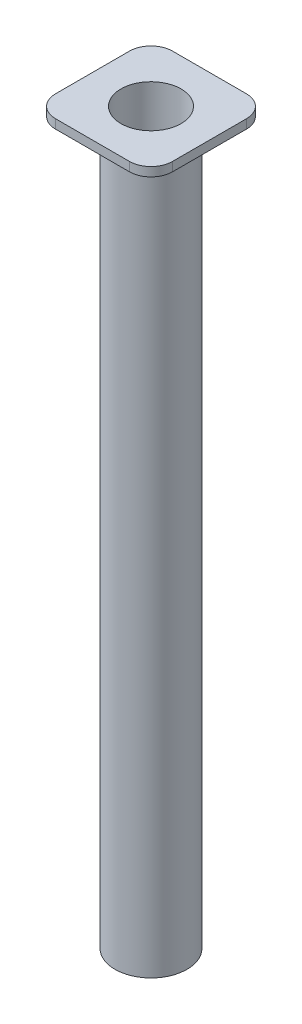
ISO-10303-21;
HEADER;
FILE_DESCRIPTION(('STEP AP214'),'2;1');
FILE_NAME('part.step','',(''),(''),'','','');
FILE_SCHEMA(('AUTOMOTIVE_DESIGN { 1 0 10303 214 1 1 1 1 }'));
ENDSEC;
DATA;
#1=APPLICATION_CONTEXT('core data for automotive mechanical design processes');
#2=APPLICATION_PROTOCOL_DEFINITION('international standard','automotive_design',2000,#1);
#3=PRODUCT_CONTEXT('',#1,'mechanical');
#4=PRODUCT('Part','Part','',(#3));
#5=PRODUCT_RELATED_PRODUCT_CATEGORY('part','',(#4));
#6=PRODUCT_DEFINITION_FORMATION('','',#4);
#7=PRODUCT_DEFINITION_CONTEXT('part definition',#1,'design');
#8=PRODUCT_DEFINITION('design','',#6,#7);
#9=PRODUCT_DEFINITION_SHAPE('','',#8);
#10=(LENGTH_UNIT() NAMED_UNIT(*) SI_UNIT(.MILLI.,.METRE.));
#11=(NAMED_UNIT(*) PLANE_ANGLE_UNIT() SI_UNIT($,.RADIAN.));
#12=(NAMED_UNIT(*) SI_UNIT($,.STERADIAN.) SOLID_ANGLE_UNIT());
#13=UNCERTAINTY_MEASURE_WITH_UNIT(LENGTH_MEASURE(1.E-05),#10,'distance_accuracy_value','');
#14=(GEOMETRIC_REPRESENTATION_CONTEXT(3) GLOBAL_UNCERTAINTY_ASSIGNED_CONTEXT((#13)) GLOBAL_UNIT_ASSIGNED_CONTEXT((#10,
#11,#12)) REPRESENTATION_CONTEXT('',''));
#15=CARTESIAN_POINT('',(0.,0.,0.));
#16=DIRECTION('',(0.,0.,1.));
#17=DIRECTION('',(1.,0.,0.));
#18=AXIS2_PLACEMENT_3D('',#15,#16,#17);
#19=CARTESIAN_POINT('',(0.,0.,0.));
#20=DIRECTION('',(0.,1.,0.));
#21=DIRECTION('',(-1.,0.,0.));
#22=AXIS2_PLACEMENT_3D('',#19,#20,#21);
#23=PLANE('',#22);
#24=CARTESIAN_POINT('',(0.,0.,0.));
#25=DIRECTION('',(0.,-1.,0.));
#26=DIRECTION('',(1.,0.,0.));
#27=AXIS2_PLACEMENT_3D('',#24,#25,#26);
#28=CIRCLE('',#27,16.7);
#29=CARTESIAN_POINT('',(16.7,0.,0.));
#30=VERTEX_POINT('',#29);
#31=EDGE_CURVE('E189',#30,#30,#28,.T.);
#32=ORIENTED_EDGE('',*,*,#31,.F.);
#33=EDGE_LOOP('',(#32));
#34=FACE_BOUND('',#33,.T.);
#35=CARTESIAN_POINT('',(0.,0.,0.));
#36=DIRECTION('',(0.,1.,0.));
#37=DIRECTION('',(-1.,0.,0.));
#38=AXIS2_PLACEMENT_3D('',#35,#36,#37);
#39=CIRCLE('',#38,20.);
#40=CARTESIAN_POINT('',(-20.,0.,0.));
#41=VERTEX_POINT('',#40);
#42=EDGE_CURVE('E11',#41,#41,#39,.T.);
#43=ORIENTED_EDGE('',*,*,#42,.F.);
#44=EDGE_LOOP('',(#43));
#45=FACE_BOUND('',#44,.T.);
#46=ADVANCED_FACE('F32',(#34,#45),#23,.F.);
#47=CARTESIAN_POINT('',(0.,405.,0.));
#48=DIRECTION('',(0.,1.,0.));
#49=DIRECTION('',(-1.,0.,0.));
#50=AXIS2_PLACEMENT_3D('',#47,#48,#49);
#51=CYLINDRICAL_SURFACE('',#50,20.);
#52=CARTESIAN_POINT('',(0.,400.,0.));
#53=DIRECTION('',(0.,-1.,0.));
#54=DIRECTION('',(1.,0.,0.));
#55=AXIS2_PLACEMENT_3D('',#52,#53,#54);
#56=CIRCLE('',#55,20.);
#57=CARTESIAN_POINT('',(20.,400.,0.));
#58=VERTEX_POINT('',#57);
#59=EDGE_CURVE('E35',#58,#58,#56,.T.);
#60=ORIENTED_EDGE('',*,*,#59,.T.);
#61=EDGE_LOOP('',(#60));
#62=FACE_BOUND('',#61,.T.);
#63=ORIENTED_EDGE('',*,*,#42,.T.);
#64=EDGE_LOOP('',(#63));
#65=FACE_BOUND('',#64,.T.);
#66=ADVANCED_FACE('F180',(#62,#65),#51,.T.);
#67=CARTESIAN_POINT('',(-20.5,400.,20.5));
#68=DIRECTION('',(0.,-1.,0.));
#69=DIRECTION('',(1.,0.,0.));
#70=AXIS2_PLACEMENT_3D('',#67,#68,#69);
#71=PLANE('',#70);
#72=CARTESIAN_POINT('',(-20.5,400.,20.5));
#73=DIRECTION('',(0.,1.,0.));
#74=DIRECTION('',(1.,0.,0.));
#75=AXIS2_PLACEMENT_3D('',#72,#73,#74);
#76=CIRCLE('',#75,12.);
#77=CARTESIAN_POINT('',(-32.5,400.,20.4999999999999));
#78=VERTEX_POINT('',#77);
#79=CARTESIAN_POINT('',(-20.5,400.,32.5));
#80=VERTEX_POINT('',#79);
#81=EDGE_CURVE('E154',#78,#80,#76,.T.);
#82=ORIENTED_EDGE('',*,*,#81,.F.);
#83=DIRECTION('',(0.,0.,1.));
#84=VECTOR('',#83,1.);
#85=CARTESIAN_POINT('',(-32.5,400.,20.4999999999999));
#86=LINE('',#85,#84);
#87=CARTESIAN_POINT('',(-32.5,400.,-20.4999999999999));
#88=VERTEX_POINT('',#87);
#89=EDGE_CURVE('E122',#88,#78,#86,.T.);
#90=ORIENTED_EDGE('',*,*,#89,.F.);
#91=CARTESIAN_POINT('',(-20.5,400.,-20.5));
#92=DIRECTION('',(0.,1.,0.));
#93=DIRECTION('',(1.,0.,0.));
#94=AXIS2_PLACEMENT_3D('',#91,#92,#93);
#95=CIRCLE('',#94,12.);
#96=CARTESIAN_POINT('',(-20.5,400.,-32.5));
#97=VERTEX_POINT('',#96);
#98=EDGE_CURVE('E106',#97,#88,#95,.T.);
#99=ORIENTED_EDGE('',*,*,#98,.F.);
#100=DIRECTION('',(-1.,0.,0.));
#101=VECTOR('',#100,1.);
#102=CARTESIAN_POINT('',(-20.5,400.,-32.5));
#103=LINE('',#102,#101);
#104=CARTESIAN_POINT('',(20.4999999999999,400.,-32.5));
#105=VERTEX_POINT('',#104);
#106=EDGE_CURVE('E120',#105,#97,#103,.T.);
#107=ORIENTED_EDGE('',*,*,#106,.F.);
#108=CARTESIAN_POINT('',(20.5,400.,-20.5));
#109=DIRECTION('',(0.,1.,0.));
#110=DIRECTION('',(1.,0.,0.));
#111=AXIS2_PLACEMENT_3D('',#108,#109,#110);
#112=CIRCLE('',#111,12.);
#113=CARTESIAN_POINT('',(32.5,400.,-20.4999999999999));
#114=VERTEX_POINT('',#113);
#115=EDGE_CURVE('E125',#114,#105,#112,.T.);
#116=ORIENTED_EDGE('',*,*,#115,.F.);
#117=DIRECTION('',(0.,0.,-1.));
#118=VECTOR('',#117,1.);
#119=CARTESIAN_POINT('',(32.5,400.,20.4999999999999));
#120=LINE('',#119,#118);
#121=CARTESIAN_POINT('',(32.5,400.,20.4999999999999));
#122=VERTEX_POINT('',#121);
#123=EDGE_CURVE('E127',#122,#114,#120,.T.);
#124=ORIENTED_EDGE('',*,*,#123,.F.);
#125=CARTESIAN_POINT('',(20.5,400.,20.5));
#126=DIRECTION('',(0.,1.,0.));
#127=DIRECTION('',(-1.,0.,0.));
#128=AXIS2_PLACEMENT_3D('',#125,#126,#127);
#129=CIRCLE('',#128,12.);
#130=CARTESIAN_POINT('',(20.4999999999999,400.,32.5));
#131=VERTEX_POINT('',#130);
#132=EDGE_CURVE('E200',#131,#122,#129,.T.);
#133=ORIENTED_EDGE('',*,*,#132,.F.);
#134=DIRECTION('',(1.,0.,0.));
#135=VECTOR('',#134,1.);
#136=CARTESIAN_POINT('',(-20.5,400.,32.5));
#137=LINE('',#136,#135);
#138=EDGE_CURVE('E198',#80,#131,#137,.T.);
#139=ORIENTED_EDGE('',*,*,#138,.F.);
#140=EDGE_LOOP('',(#82,#90,#99,#107,#116,#124,#133,#139));
#141=FACE_BOUND('',#140,.T.);
#142=ORIENTED_EDGE('',*,*,#59,.F.);
#143=EDGE_LOOP('',(#142));
#144=FACE_BOUND('',#143,.T.);
#145=ADVANCED_FACE('F117',(#141,#144),#71,.T.);
#146=CARTESIAN_POINT('',(-20.5,400.,20.5));
#147=DIRECTION('',(0.,1.,0.));
#148=DIRECTION('',(-1.,0.,0.));
#149=AXIS2_PLACEMENT_3D('',#146,#147,#148);
#150=CYLINDRICAL_SURFACE('',#149,12.);
#151=CARTESIAN_POINT('',(-20.5,405.,20.5));
#152=DIRECTION('',(0.,1.,0.));
#153=DIRECTION('',(1.,0.,0.));
#154=AXIS2_PLACEMENT_3D('',#151,#152,#153);
#155=CIRCLE('',#154,12.);
#156=CARTESIAN_POINT('',(-32.5,405.,20.4999999999999));
#157=VERTEX_POINT('',#156);
#158=CARTESIAN_POINT('',(-20.5,405.,32.5));
#159=VERTEX_POINT('',#158);
#160=EDGE_CURVE('E132',#157,#159,#155,.T.);
#161=ORIENTED_EDGE('',*,*,#160,.F.);
#162=DIRECTION('',(0.,1.,0.));
#163=VECTOR('',#162,1.);
#164=CARTESIAN_POINT('',(-32.5,400.,20.4999999999999));
#165=LINE('',#164,#163);
#166=EDGE_CURVE('E48',#78,#157,#165,.T.);
#167=ORIENTED_EDGE('',*,*,#166,.F.);
#168=ORIENTED_EDGE('',*,*,#81,.T.);
#169=DIRECTION('',(0.,1.,0.));
#170=VECTOR('',#169,1.);
#171=CARTESIAN_POINT('',(-20.5,400.,32.5));
#172=LINE('',#171,#170);
#173=EDGE_CURVE('E89',#80,#159,#172,.T.);
#174=ORIENTED_EDGE('',*,*,#173,.T.);
#175=EDGE_LOOP('',(#161,#167,#168,#174));
#176=FACE_BOUND('',#175,.T.);
#177=ADVANCED_FACE('F164',(#176),#150,.T.);
#178=CARTESIAN_POINT('',(-32.5,400.,20.4999999999999));
#179=DIRECTION('',(-1.,0.,0.));
#180=DIRECTION('',(0.,-1.,0.));
#181=AXIS2_PLACEMENT_3D('',#178,#179,#180);
#182=PLANE('',#181);
#183=DIRECTION('',(0.,0.,1.));
#184=VECTOR('',#183,1.);
#185=CARTESIAN_POINT('',(-32.5,405.,20.4999999999999));
#186=LINE('',#185,#184);
#187=CARTESIAN_POINT('',(-32.5,405.,-20.4999999999999));
#188=VERTEX_POINT('',#187);
#189=EDGE_CURVE('E151',#188,#157,#186,.T.);
#190=ORIENTED_EDGE('',*,*,#189,.F.);
#191=DIRECTION('',(0.,1.,0.));
#192=VECTOR('',#191,1.);
#193=CARTESIAN_POINT('',(-32.5,400.,-20.4999999999999));
#194=LINE('',#193,#192);
#195=EDGE_CURVE('E77',#88,#188,#194,.T.);
#196=ORIENTED_EDGE('',*,*,#195,.F.);
#197=ORIENTED_EDGE('',*,*,#89,.T.);
#198=ORIENTED_EDGE('',*,*,#166,.T.);
#199=EDGE_LOOP('',(#190,#196,#197,#198));
#200=FACE_BOUND('',#199,.T.);
#201=ADVANCED_FACE('F169',(#200),#182,.T.);
#202=CARTESIAN_POINT('',(-20.5,400.,-20.5));
#203=DIRECTION('',(0.,1.,0.));
#204=DIRECTION('',(-1.,0.,0.));
#205=AXIS2_PLACEMENT_3D('',#202,#203,#204);
#206=CYLINDRICAL_SURFACE('',#205,12.);
#207=CARTESIAN_POINT('',(-20.5,405.,-20.5));
#208=DIRECTION('',(0.,1.,0.));
#209=DIRECTION('',(1.,0.,0.));
#210=AXIS2_PLACEMENT_3D('',#207,#208,#209);
#211=CIRCLE('',#210,12.);
#212=CARTESIAN_POINT('',(-20.5,405.,-32.5));
#213=VERTEX_POINT('',#212);
#214=EDGE_CURVE('E108',#213,#188,#211,.T.);
#215=ORIENTED_EDGE('',*,*,#214,.F.);
#216=DIRECTION('',(0.,1.,0.));
#217=VECTOR('',#216,1.);
#218=CARTESIAN_POINT('',(-20.5,400.,-32.5));
#219=LINE('',#218,#217);
#220=EDGE_CURVE('E103',#97,#213,#219,.T.);
#221=ORIENTED_EDGE('',*,*,#220,.F.);
#222=ORIENTED_EDGE('',*,*,#98,.T.);
#223=ORIENTED_EDGE('',*,*,#195,.T.);
#224=EDGE_LOOP('',(#215,#221,#222,#223));
#225=FACE_BOUND('',#224,.T.);
#226=ADVANCED_FACE('F105',(#225),#206,.T.);
#227=CARTESIAN_POINT('',(-20.5,400.,-32.5));
#228=DIRECTION('',(0.,0.,-1.));
#229=DIRECTION('',(-1.,0.,0.));
#230=AXIS2_PLACEMENT_3D('',#227,#228,#229);
#231=PLANE('',#230);
#232=DIRECTION('',(-1.,0.,0.));
#233=VECTOR('',#232,1.);
#234=CARTESIAN_POINT('',(-20.5,405.,-32.5));
#235=LINE('',#234,#233);
#236=CARTESIAN_POINT('',(20.4999999999999,405.,-32.5));
#237=VERTEX_POINT('',#236);
#238=EDGE_CURVE('E148',#237,#213,#235,.T.);
#239=ORIENTED_EDGE('',*,*,#238,.F.);
#240=DIRECTION('',(0.,1.,0.));
#241=VECTOR('',#240,1.);
#242=CARTESIAN_POINT('',(20.4999999999999,400.,-32.5));
#243=LINE('',#242,#241);
#244=EDGE_CURVE('E113',#105,#237,#243,.T.);
#245=ORIENTED_EDGE('',*,*,#244,.F.);
#246=ORIENTED_EDGE('',*,*,#106,.T.);
#247=ORIENTED_EDGE('',*,*,#220,.T.);
#248=EDGE_LOOP('',(#239,#245,#246,#247));
#249=FACE_BOUND('',#248,.T.);
#250=ADVANCED_FACE('F124',(#249),#231,.T.);
#251=CARTESIAN_POINT('',(20.5,400.,-20.5));
#252=DIRECTION('',(0.,1.,0.));
#253=DIRECTION('',(-1.,0.,0.));
#254=AXIS2_PLACEMENT_3D('',#251,#252,#253);
#255=CYLINDRICAL_SURFACE('',#254,12.);
#256=CARTESIAN_POINT('',(20.5,405.,-20.5));
#257=DIRECTION('',(0.,1.,0.));
#258=DIRECTION('',(1.,0.,0.));
#259=AXIS2_PLACEMENT_3D('',#256,#257,#258);
#260=CIRCLE('',#259,12.);
#261=CARTESIAN_POINT('',(32.5,405.,-20.4999999999999));
#262=VERTEX_POINT('',#261);
#263=EDGE_CURVE('E145',#262,#237,#260,.T.);
#264=ORIENTED_EDGE('',*,*,#263,.F.);
#265=DIRECTION('',(0.,1.,0.));
#266=VECTOR('',#265,1.);
#267=CARTESIAN_POINT('',(32.5,400.,-20.4999999999999));
#268=LINE('',#267,#266);
#269=EDGE_CURVE('E158',#114,#262,#268,.T.);
#270=ORIENTED_EDGE('',*,*,#269,.F.);
#271=ORIENTED_EDGE('',*,*,#115,.T.);
#272=ORIENTED_EDGE('',*,*,#244,.T.);
#273=EDGE_LOOP('',(#264,#270,#271,#272));
#274=FACE_BOUND('',#273,.T.);
#275=ADVANCED_FACE('F212',(#274),#255,.T.);
#276=CARTESIAN_POINT('',(32.5,400.,20.4999999999999));
#277=DIRECTION('',(1.,0.,0.));
#278=DIRECTION('',(0.,1.,0.));
#279=AXIS2_PLACEMENT_3D('',#276,#277,#278);
#280=PLANE('',#279);
#281=DIRECTION('',(0.,0.,-1.));
#282=VECTOR('',#281,1.);
#283=CARTESIAN_POINT('',(32.5,405.,20.4999999999999));
#284=LINE('',#283,#282);
#285=CARTESIAN_POINT('',(32.5,405.,20.4999999999999));
#286=VERTEX_POINT('',#285);
#287=EDGE_CURVE('E142',#286,#262,#284,.T.);
#288=ORIENTED_EDGE('',*,*,#287,.F.);
#289=DIRECTION('',(0.,1.,0.));
#290=VECTOR('',#289,1.);
#291=CARTESIAN_POINT('',(32.5,400.,20.4999999999999));
#292=LINE('',#291,#290);
#293=EDGE_CURVE('E160',#122,#286,#292,.T.);
#294=ORIENTED_EDGE('',*,*,#293,.F.);
#295=ORIENTED_EDGE('',*,*,#123,.T.);
#296=ORIENTED_EDGE('',*,*,#269,.T.);
#297=EDGE_LOOP('',(#288,#294,#295,#296));
#298=FACE_BOUND('',#297,.T.);
#299=ADVANCED_FACE('F206',(#298),#280,.T.);
#300=CARTESIAN_POINT('',(20.5,400.,20.5));
#301=DIRECTION('',(0.,1.,0.));
#302=DIRECTION('',(-1.,0.,0.));
#303=AXIS2_PLACEMENT_3D('',#300,#301,#302);
#304=CYLINDRICAL_SURFACE('',#303,12.);
#305=CARTESIAN_POINT('',(20.5,405.,20.5));
#306=DIRECTION('',(0.,1.,0.));
#307=DIRECTION('',(-1.,0.,0.));
#308=AXIS2_PLACEMENT_3D('',#305,#306,#307);
#309=CIRCLE('',#308,12.);
#310=CARTESIAN_POINT('',(20.4999999999999,405.,32.5));
#311=VERTEX_POINT('',#310);
#312=EDGE_CURVE('E139',#311,#286,#309,.T.);
#313=ORIENTED_EDGE('',*,*,#312,.F.);
#314=DIRECTION('',(0.,1.,0.));
#315=VECTOR('',#314,1.);
#316=CARTESIAN_POINT('',(20.4999999999999,400.,32.5));
#317=LINE('',#316,#315);
#318=EDGE_CURVE('E162',#131,#311,#317,.T.);
#319=ORIENTED_EDGE('',*,*,#318,.F.);
#320=ORIENTED_EDGE('',*,*,#132,.T.);
#321=ORIENTED_EDGE('',*,*,#293,.T.);
#322=EDGE_LOOP('',(#313,#319,#320,#321));
#323=FACE_BOUND('',#322,.T.);
#324=ADVANCED_FACE('F210',(#323),#304,.T.);
#325=CARTESIAN_POINT('',(-20.5,400.,32.5));
#326=DIRECTION('',(0.,0.,1.));
#327=DIRECTION('',(1.,0.,0.));
#328=AXIS2_PLACEMENT_3D('',#325,#326,#327);
#329=PLANE('',#328);
#330=DIRECTION('',(1.,0.,0.));
#331=VECTOR('',#330,1.);
#332=CARTESIAN_POINT('',(-20.5,405.,32.5));
#333=LINE('',#332,#331);
#334=EDGE_CURVE('E135',#159,#311,#333,.T.);
#335=ORIENTED_EDGE('',*,*,#334,.F.);
#336=ORIENTED_EDGE('',*,*,#173,.F.);
#337=ORIENTED_EDGE('',*,*,#138,.T.);
#338=ORIENTED_EDGE('',*,*,#318,.T.);
#339=EDGE_LOOP('',(#335,#336,#337,#338));
#340=FACE_BOUND('',#339,.T.);
#341=ADVANCED_FACE('F165',(#340),#329,.T.);
#342=CARTESIAN_POINT('',(20.,405.,0.));
#343=DIRECTION('',(0.,-1.,0.));
#344=DIRECTION('',(1.,0.,0.));
#345=AXIS2_PLACEMENT_3D('',#342,#343,#344);
#346=PLANE('',#345);
#347=CARTESIAN_POINT('',(0.,405.,0.));
#348=DIRECTION('',(0.,-1.,0.));
#349=DIRECTION('',(1.,0.,0.));
#350=AXIS2_PLACEMENT_3D('',#347,#348,#349);
#351=CIRCLE('',#350,16.7);
#352=CARTESIAN_POINT('',(16.7,405.,0.));
#353=VERTEX_POINT('',#352);
#354=EDGE_CURVE('E136',#353,#353,#351,.F.);
#355=ORIENTED_EDGE('',*,*,#354,.F.);
#356=EDGE_LOOP('',(#355));
#357=FACE_BOUND('',#356,.T.);
#358=ORIENTED_EDGE('',*,*,#160,.T.);
#359=ORIENTED_EDGE('',*,*,#334,.T.);
#360=ORIENTED_EDGE('',*,*,#312,.T.);
#361=ORIENTED_EDGE('',*,*,#287,.T.);
#362=ORIENTED_EDGE('',*,*,#263,.T.);
#363=ORIENTED_EDGE('',*,*,#238,.T.);
#364=ORIENTED_EDGE('',*,*,#214,.T.);
#365=ORIENTED_EDGE('',*,*,#189,.T.);
#366=EDGE_LOOP('',(#358,#359,#360,#361,#362,#363,#364,#365));
#367=FACE_BOUND('',#366,.T.);
#368=ADVANCED_FACE('F168',(#357,#367),#346,.F.);
#369=CARTESIAN_POINT('',(0.,405.001,0.));
#370=DIRECTION('',(0.,-1.,0.));
#371=DIRECTION('',(1.,0.,0.));
#372=AXIS2_PLACEMENT_3D('',#369,#370,#371);
#373=CYLINDRICAL_SURFACE('',#372,16.7);
#374=ORIENTED_EDGE('',*,*,#31,.T.);
#375=EDGE_LOOP('',(#374));
#376=FACE_BOUND('',#375,.T.);
#377=ORIENTED_EDGE('',*,*,#354,.T.);
#378=EDGE_LOOP('',(#377));
#379=FACE_BOUND('',#378,.T.);
#380=ADVANCED_FACE('F227',(#376,#379),#373,.F.);
#381=CLOSED_SHELL('',(#46,#66,#145,#177,#201,#226,#250,#275,#299,#324,#341,#368,#380));
#382=MANIFOLD_SOLID_BREP('B2',#381);
#383=ADVANCED_BREP_SHAPE_REPRESENTATION('',(#18,#382),#14);
#384=SHAPE_DEFINITION_REPRESENTATION(#9,#383);
ENDSEC;
END-ISO-10303-21;
